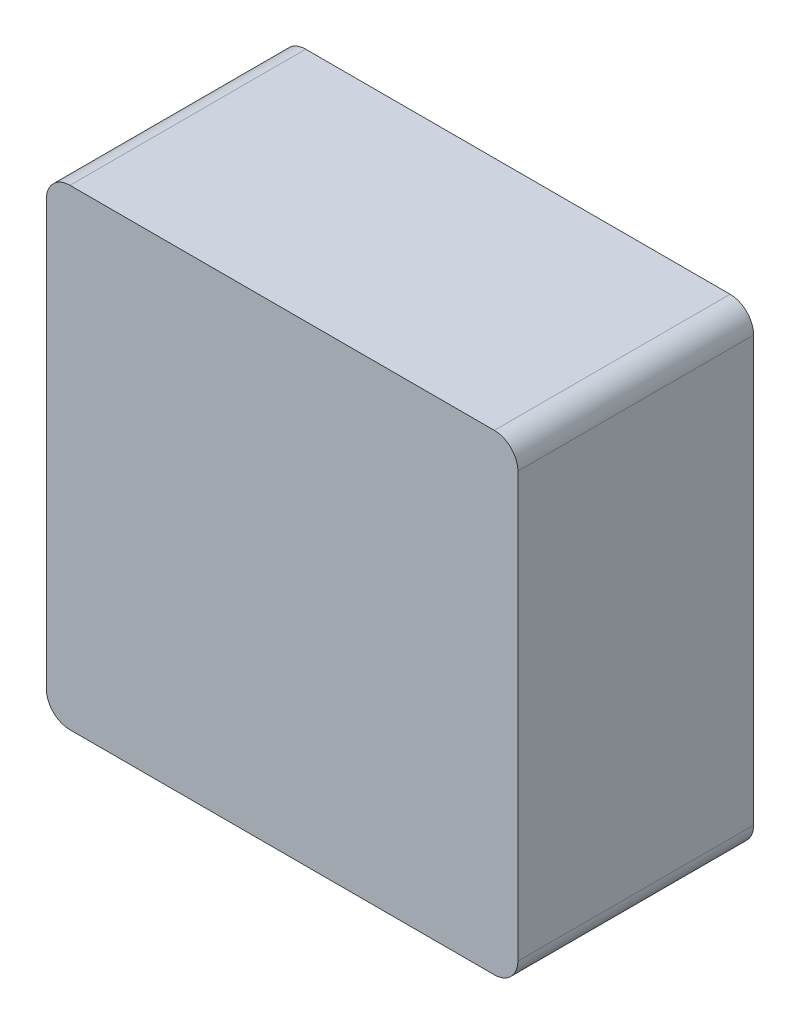
ISO-10303-21;
HEADER;
FILE_DESCRIPTION(('STEP AP214'),'2;1');
FILE_NAME('part.step','',(''),(''),'','','');
FILE_SCHEMA(('AUTOMOTIVE_DESIGN { 1 0 10303 214 1 1 1 1 }'));
ENDSEC;
DATA;
#1=APPLICATION_CONTEXT('core data for automotive mechanical design processes');
#2=APPLICATION_PROTOCOL_DEFINITION('international standard','automotive_design',2000,#1);
#3=PRODUCT_CONTEXT('',#1,'mechanical');
#4=PRODUCT('Part','Part','',(#3));
#5=PRODUCT_RELATED_PRODUCT_CATEGORY('part','',(#4));
#6=PRODUCT_DEFINITION_FORMATION('','',#4);
#7=PRODUCT_DEFINITION_CONTEXT('part definition',#1,'design');
#8=PRODUCT_DEFINITION('design','',#6,#7);
#9=PRODUCT_DEFINITION_SHAPE('','',#8);
#10=(LENGTH_UNIT() NAMED_UNIT(*) SI_UNIT(.MILLI.,.METRE.));
#11=(NAMED_UNIT(*) PLANE_ANGLE_UNIT() SI_UNIT($,.RADIAN.));
#12=(NAMED_UNIT(*) SI_UNIT($,.STERADIAN.) SOLID_ANGLE_UNIT());
#13=UNCERTAINTY_MEASURE_WITH_UNIT(LENGTH_MEASURE(1.E-05),#10,'distance_accuracy_value','');
#14=(GEOMETRIC_REPRESENTATION_CONTEXT(3) GLOBAL_UNCERTAINTY_ASSIGNED_CONTEXT((#13)) GLOBAL_UNIT_ASSIGNED_CONTEXT((#10,
#11,#12)) REPRESENTATION_CONTEXT('',''));
#15=CARTESIAN_POINT('',(0.,0.,0.));
#16=DIRECTION('',(0.,0.,1.));
#17=DIRECTION('',(1.,0.,0.));
#18=AXIS2_PLACEMENT_3D('',#15,#16,#17);
#19=CARTESIAN_POINT('',(0.,0.,50.));
#20=DIRECTION('',(0.,0.,-1.));
#21=DIRECTION('',(-1.,0.,0.));
#22=AXIS2_PLACEMENT_3D('',#19,#20,#21);
#23=CYLINDRICAL_SURFACE('',#22,50.);
#24=CARTESIAN_POINT('',(0.,0.,10.));
#25=DIRECTION('',(0.,0.,1.));
#26=DIRECTION('',(1.,0.,0.));
#27=AXIS2_PLACEMENT_3D('',#24,#25,#26);
#28=CIRCLE('',#27,50.);
#29=CARTESIAN_POINT('',(50.,0.,10.));
#30=VERTEX_POINT('',#29);
#31=EDGE_CURVE('E160',#30,#30,#28,.T.);
#32=ORIENTED_EDGE('',*,*,#31,.T.);
#33=EDGE_LOOP('',(#32));
#34=FACE_BOUND('',#33,.T.);
#35=CARTESIAN_POINT('',(0.,0.,40.));
#36=DIRECTION('',(0.,0.,1.));
#37=DIRECTION('',(1.,0.,0.));
#38=AXIS2_PLACEMENT_3D('',#35,#36,#37);
#39=CIRCLE('',#38,50.);
#40=CARTESIAN_POINT('',(50.,0.,40.));
#41=VERTEX_POINT('',#40);
#42=EDGE_CURVE('E156',#41,#41,#39,.F.);
#43=ORIENTED_EDGE('',*,*,#42,.T.);
#44=EDGE_LOOP('',(#43));
#45=FACE_BOUND('',#44,.T.);
#46=ADVANCED_FACE('F51',(#34,#45),#23,.T.);
#47=CARTESIAN_POINT('',(0.,0.,0.));
#48=DIRECTION('',(0.,0.,1.));
#49=DIRECTION('',(1.,0.,0.));
#50=AXIS2_PLACEMENT_3D('',#47,#48,#49);
#51=PLANE('',#50);
#52=CARTESIAN_POINT('',(0.,0.,0.));
#53=DIRECTION('',(0.,0.,1.));
#54=DIRECTION('',(1.,0.,0.));
#55=AXIS2_PLACEMENT_3D('',#52,#53,#54);
#56=CIRCLE('',#55,40.);
#57=CARTESIAN_POINT('',(40.,0.,0.));
#58=VERTEX_POINT('',#57);
#59=EDGE_CURVE('E128',#58,#58,#56,.F.);
#60=ORIENTED_EDGE('',*,*,#59,.T.);
#61=EDGE_LOOP('',(#60));
#62=FACE_BOUND('',#61,.T.);
#63=ADVANCED_FACE('F249',(#62),#51,.F.);
#64=CARTESIAN_POINT('',(-100.,100.,150.));
#65=DIRECTION('',(1.,0.,0.));
#66=DIRECTION('',(0.,1.,0.));
#67=AXIS2_PLACEMENT_3D('',#64,#65,#66);
#68=PLANE('',#67);
#69=DIRECTION('',(0.,-1.,0.));
#70=VECTOR('',#69,1.);
#71=CARTESIAN_POINT('',(-100.,100.,50.));
#72=LINE('',#71,#70);
#73=CARTESIAN_POINT('',(-100.,90.,50.));
#74=VERTEX_POINT('',#73);
#75=CARTESIAN_POINT('',(-100.,-90.,50.));
#76=VERTEX_POINT('',#75);
#77=EDGE_CURVE('E134',#74,#76,#72,.T.);
#78=ORIENTED_EDGE('',*,*,#77,.T.);
#79=DIRECTION('',(0.,0.,-1.));
#80=VECTOR('',#79,1.);
#81=CARTESIAN_POINT('',(-100.,-90.,150.));
#82=LINE('',#81,#80);
#83=CARTESIAN_POINT('',(-100.,-90.,150.));
#84=VERTEX_POINT('',#83);
#85=EDGE_CURVE('E11',#76,#84,#82,.F.);
#86=ORIENTED_EDGE('',*,*,#85,.T.);
#87=DIRECTION('',(0.,-1.,0.));
#88=VECTOR('',#87,1.);
#89=CARTESIAN_POINT('',(-100.,100.,150.));
#90=LINE('',#89,#88);
#91=CARTESIAN_POINT('',(-100.,90.,150.));
#92=VERTEX_POINT('',#91);
#93=EDGE_CURVE('E136',#92,#84,#90,.T.);
#94=ORIENTED_EDGE('',*,*,#93,.F.);
#95=DIRECTION('',(0.,0.,-1.));
#96=VECTOR('',#95,1.);
#97=CARTESIAN_POINT('',(-100.,90.,150.));
#98=LINE('',#97,#96);
#99=EDGE_CURVE('E60',#92,#74,#98,.T.);
#100=ORIENTED_EDGE('',*,*,#99,.T.);
#101=EDGE_LOOP('',(#78,#86,#94,#100));
#102=FACE_BOUND('',#101,.T.);
#103=ADVANCED_FACE('F133',(#102),#68,.F.);
#104=CARTESIAN_POINT('',(-100.,-100.,150.));
#105=DIRECTION('',(0.,1.,0.));
#106=DIRECTION('',(0.,0.,1.));
#107=AXIS2_PLACEMENT_3D('',#104,#105,#106);
#108=PLANE('',#107);
#109=DIRECTION('',(1.,0.,0.));
#110=VECTOR('',#109,1.);
#111=CARTESIAN_POINT('',(-100.,-100.,50.));
#112=LINE('',#111,#110);
#113=CARTESIAN_POINT('',(-90.,-100.,50.));
#114=VERTEX_POINT('',#113);
#115=CARTESIAN_POINT('',(90.,-100.,50.));
#116=VERTEX_POINT('',#115);
#117=EDGE_CURVE('E141',#114,#116,#112,.T.);
#118=ORIENTED_EDGE('',*,*,#117,.T.);
#119=DIRECTION('',(0.,0.,-1.));
#120=VECTOR('',#119,1.);
#121=CARTESIAN_POINT('',(90.,-100.,150.));
#122=LINE('',#121,#120);
#123=CARTESIAN_POINT('',(90.,-100.,150.));
#124=VERTEX_POINT('',#123);
#125=EDGE_CURVE('E67',#116,#124,#122,.F.);
#126=ORIENTED_EDGE('',*,*,#125,.T.);
#127=DIRECTION('',(1.,0.,0.));
#128=VECTOR('',#127,1.);
#129=CARTESIAN_POINT('',(-100.,-100.,150.));
#130=LINE('',#129,#128);
#131=CARTESIAN_POINT('',(-90.,-100.,150.));
#132=VERTEX_POINT('',#131);
#133=EDGE_CURVE('E214',#132,#124,#130,.T.);
#134=ORIENTED_EDGE('',*,*,#133,.F.);
#135=DIRECTION('',(0.,0.,-1.));
#136=VECTOR('',#135,1.);
#137=CARTESIAN_POINT('',(-90.,-100.,150.));
#138=LINE('',#137,#136);
#139=EDGE_CURVE('E203',#132,#114,#138,.T.);
#140=ORIENTED_EDGE('',*,*,#139,.T.);
#141=EDGE_LOOP('',(#118,#126,#134,#140));
#142=FACE_BOUND('',#141,.T.);
#143=ADVANCED_FACE('F222',(#142),#108,.F.);
#144=CARTESIAN_POINT('',(100.,100.,150.));
#145=DIRECTION('',(-1.,0.,0.));
#146=DIRECTION('',(0.,-1.,0.));
#147=AXIS2_PLACEMENT_3D('',#144,#145,#146);
#148=PLANE('',#147);
#149=DIRECTION('',(0.,1.,0.));
#150=VECTOR('',#149,1.);
#151=CARTESIAN_POINT('',(100.,100.,50.));
#152=LINE('',#151,#150);
#153=CARTESIAN_POINT('',(100.,-90.,50.));
#154=VERTEX_POINT('',#153);
#155=CARTESIAN_POINT('',(100.,90.,50.));
#156=VERTEX_POINT('',#155);
#157=EDGE_CURVE('E144',#154,#156,#152,.T.);
#158=ORIENTED_EDGE('',*,*,#157,.T.);
#159=DIRECTION('',(0.,0.,-1.));
#160=VECTOR('',#159,1.);
#161=CARTESIAN_POINT('',(100.,90.,150.));
#162=LINE('',#161,#160);
#163=CARTESIAN_POINT('',(100.,90.,150.));
#164=VERTEX_POINT('',#163);
#165=EDGE_CURVE('E189',#156,#164,#162,.F.);
#166=ORIENTED_EDGE('',*,*,#165,.T.);
#167=DIRECTION('',(0.,1.,0.));
#168=VECTOR('',#167,1.);
#169=CARTESIAN_POINT('',(100.,100.,150.));
#170=LINE('',#169,#168);
#171=CARTESIAN_POINT('',(100.,-90.,150.));
#172=VERTEX_POINT('',#171);
#173=EDGE_CURVE('E211',#172,#164,#170,.T.);
#174=ORIENTED_EDGE('',*,*,#173,.F.);
#175=DIRECTION('',(0.,0.,-1.));
#176=VECTOR('',#175,1.);
#177=CARTESIAN_POINT('',(100.,-90.,150.));
#178=LINE('',#177,#176);
#179=EDGE_CURVE('E185',#172,#154,#178,.T.);
#180=ORIENTED_EDGE('',*,*,#179,.T.);
#181=EDGE_LOOP('',(#158,#166,#174,#180));
#182=FACE_BOUND('',#181,.T.);
#183=ADVANCED_FACE('F230',(#182),#148,.F.);
#184=CARTESIAN_POINT('',(-100.,100.,150.));
#185=DIRECTION('',(0.,-1.,0.));
#186=DIRECTION('',(0.,0.,-1.));
#187=AXIS2_PLACEMENT_3D('',#184,#185,#186);
#188=PLANE('',#187);
#189=DIRECTION('',(-1.,0.,0.));
#190=VECTOR('',#189,1.);
#191=CARTESIAN_POINT('',(-100.,100.,150.));
#192=LINE('',#191,#190);
#193=CARTESIAN_POINT('',(90.,100.,150.));
#194=VERTEX_POINT('',#193);
#195=CARTESIAN_POINT('',(-90.,100.,150.));
#196=VERTEX_POINT('',#195);
#197=EDGE_CURVE('E147',#194,#196,#192,.T.);
#198=ORIENTED_EDGE('',*,*,#197,.F.);
#199=DIRECTION('',(0.,0.,-1.));
#200=VECTOR('',#199,1.);
#201=CARTESIAN_POINT('',(90.,100.,150.));
#202=LINE('',#201,#200);
#203=CARTESIAN_POINT('',(90.,100.,50.));
#204=VERTEX_POINT('',#203);
#205=EDGE_CURVE('E181',#194,#204,#202,.T.);
#206=ORIENTED_EDGE('',*,*,#205,.T.);
#207=DIRECTION('',(-1.,0.,0.));
#208=VECTOR('',#207,1.);
#209=CARTESIAN_POINT('',(-100.,100.,50.));
#210=LINE('',#209,#208);
#211=CARTESIAN_POINT('',(-90.,100.,50.));
#212=VERTEX_POINT('',#211);
#213=EDGE_CURVE('E153',#204,#212,#210,.T.);
#214=ORIENTED_EDGE('',*,*,#213,.T.);
#215=DIRECTION('',(0.,0.,-1.));
#216=VECTOR('',#215,1.);
#217=CARTESIAN_POINT('',(-90.,100.,150.));
#218=LINE('',#217,#216);
#219=EDGE_CURVE('E121',#212,#196,#218,.F.);
#220=ORIENTED_EDGE('',*,*,#219,.T.);
#221=EDGE_LOOP('',(#198,#206,#214,#220));
#222=FACE_BOUND('',#221,.T.);
#223=ADVANCED_FACE('F238',(#222),#188,.F.);
#224=CARTESIAN_POINT('',(0.,0.,150.));
#225=DIRECTION('',(0.,0.,1.));
#226=DIRECTION('',(1.,0.,0.));
#227=AXIS2_PLACEMENT_3D('',#224,#225,#226);
#228=PLANE('',#227);
#229=ORIENTED_EDGE('',*,*,#173,.T.);
#230=CARTESIAN_POINT('',(90.,90.,150.));
#231=DIRECTION('',(0.,0.,1.));
#232=DIRECTION('',(1.,0.,0.));
#233=AXIS2_PLACEMENT_3D('',#230,#231,#232);
#234=CIRCLE('',#233,10.);
#235=EDGE_CURVE('E200',#164,#194,#234,.T.);
#236=ORIENTED_EDGE('',*,*,#235,.T.);
#237=ORIENTED_EDGE('',*,*,#197,.T.);
#238=CARTESIAN_POINT('',(-90.,90.,150.));
#239=DIRECTION('',(0.,0.,1.));
#240=DIRECTION('',(1.,0.,0.));
#241=AXIS2_PLACEMENT_3D('',#238,#239,#240);
#242=CIRCLE('',#241,10.);
#243=EDGE_CURVE('E192',#196,#92,#242,.T.);
#244=ORIENTED_EDGE('',*,*,#243,.T.);
#245=ORIENTED_EDGE('',*,*,#93,.T.);
#246=CARTESIAN_POINT('',(-90.,-90.,150.));
#247=DIRECTION('',(0.,0.,1.));
#248=DIRECTION('',(1.,0.,0.));
#249=AXIS2_PLACEMENT_3D('',#246,#247,#248);
#250=CIRCLE('',#249,10.);
#251=EDGE_CURVE('E74',#84,#132,#250,.T.);
#252=ORIENTED_EDGE('',*,*,#251,.T.);
#253=ORIENTED_EDGE('',*,*,#133,.T.);
#254=CARTESIAN_POINT('',(90.,-90.,150.));
#255=DIRECTION('',(0.,0.,1.));
#256=DIRECTION('',(1.,0.,0.));
#257=AXIS2_PLACEMENT_3D('',#254,#255,#256);
#258=CIRCLE('',#257,10.);
#259=EDGE_CURVE('E197',#124,#172,#258,.T.);
#260=ORIENTED_EDGE('',*,*,#259,.T.);
#261=EDGE_LOOP('',(#229,#236,#237,#244,#245,#252,#253,#260));
#262=FACE_BOUND('',#261,.T.);
#263=ADVANCED_FACE('F218',(#262),#228,.T.);
#264=CARTESIAN_POINT('',(0.,0.,50.));
#265=DIRECTION('',(0.,0.,1.));
#266=DIRECTION('',(1.,0.,0.));
#267=AXIS2_PLACEMENT_3D('',#264,#265,#266);
#268=PLANE('',#267);
#269=CARTESIAN_POINT('',(0.,0.,50.));
#270=DIRECTION('',(0.,0.,1.));
#271=DIRECTION('',(1.,0.,0.));
#272=AXIS2_PLACEMENT_3D('',#269,#270,#271);
#273=CIRCLE('',#272,60.);
#274=CARTESIAN_POINT('',(60.,0.,50.));
#275=VERTEX_POINT('',#274);
#276=EDGE_CURVE('E175',#275,#275,#273,.T.);
#277=ORIENTED_EDGE('',*,*,#276,.T.);
#278=EDGE_LOOP('',(#277));
#279=FACE_BOUND('',#278,.T.);
#280=ORIENTED_EDGE('',*,*,#213,.F.);
#281=CARTESIAN_POINT('',(90.,90.,50.));
#282=DIRECTION('',(0.,0.,1.));
#283=DIRECTION('',(1.,0.,0.));
#284=AXIS2_PLACEMENT_3D('',#281,#282,#283);
#285=CIRCLE('',#284,10.);
#286=EDGE_CURVE('E172',#204,#156,#285,.F.);
#287=ORIENTED_EDGE('',*,*,#286,.T.);
#288=ORIENTED_EDGE('',*,*,#157,.F.);
#289=CARTESIAN_POINT('',(90.,-90.,50.));
#290=DIRECTION('',(0.,0.,1.));
#291=DIRECTION('',(1.,0.,0.));
#292=AXIS2_PLACEMENT_3D('',#289,#290,#291);
#293=CIRCLE('',#292,10.);
#294=EDGE_CURVE('E169',#154,#116,#293,.F.);
#295=ORIENTED_EDGE('',*,*,#294,.T.);
#296=ORIENTED_EDGE('',*,*,#117,.F.);
#297=CARTESIAN_POINT('',(-90.,-90.,50.));
#298=DIRECTION('',(0.,0.,1.));
#299=DIRECTION('',(1.,0.,0.));
#300=AXIS2_PLACEMENT_3D('',#297,#298,#299);
#301=CIRCLE('',#300,10.);
#302=EDGE_CURVE('E127',#114,#76,#301,.F.);
#303=ORIENTED_EDGE('',*,*,#302,.T.);
#304=ORIENTED_EDGE('',*,*,#77,.F.);
#305=CARTESIAN_POINT('',(-90.,90.,50.));
#306=DIRECTION('',(0.,0.,1.));
#307=DIRECTION('',(1.,0.,0.));
#308=AXIS2_PLACEMENT_3D('',#305,#306,#307);
#309=CIRCLE('',#308,10.);
#310=EDGE_CURVE('E118',#74,#212,#309,.F.);
#311=ORIENTED_EDGE('',*,*,#310,.T.);
#312=EDGE_LOOP('',(#280,#287,#288,#295,#296,#303,#304,#311));
#313=FACE_BOUND('',#312,.T.);
#314=ADVANCED_FACE('F138',(#279,#313),#268,.F.);
#315=CARTESIAN_POINT('',(0.,0.,10.));
#316=DIRECTION('',(0.,0.,1.));
#317=DIRECTION('',(1.,0.,0.));
#318=AXIS2_PLACEMENT_3D('',#315,#316,#317);
#319=TOROIDAL_SURFACE('',#318,40.,10.);
#320=ORIENTED_EDGE('',*,*,#59,.F.);
#321=EDGE_LOOP('',(#320));
#322=FACE_BOUND('',#321,.T.);
#323=ORIENTED_EDGE('',*,*,#31,.F.);
#324=EDGE_LOOP('',(#323));
#325=FACE_BOUND('',#324,.T.);
#326=ADVANCED_FACE('F260',(#322,#325),#319,.T.);
#327=CARTESIAN_POINT('',(0.,0.,40.));
#328=DIRECTION('',(0.,0.,1.));
#329=DIRECTION('',(1.,0.,0.));
#330=AXIS2_PLACEMENT_3D('',#327,#328,#329);
#331=TOROIDAL_SURFACE('',#330,60.,10.);
#332=ORIENTED_EDGE('',*,*,#42,.F.);
#333=EDGE_LOOP('',(#332));
#334=FACE_BOUND('',#333,.T.);
#335=ORIENTED_EDGE('',*,*,#276,.F.);
#336=EDGE_LOOP('',(#335));
#337=FACE_BOUND('',#336,.T.);
#338=ADVANCED_FACE('F263',(#334,#337),#331,.F.);
#339=CARTESIAN_POINT('',(90.,90.,150.));
#340=DIRECTION('',(0.,0.,-1.));
#341=DIRECTION('',(-1.,0.,0.));
#342=AXIS2_PLACEMENT_3D('',#339,#340,#341);
#343=CYLINDRICAL_SURFACE('',#342,10.);
#344=ORIENTED_EDGE('',*,*,#235,.F.);
#345=ORIENTED_EDGE('',*,*,#165,.F.);
#346=ORIENTED_EDGE('',*,*,#286,.F.);
#347=ORIENTED_EDGE('',*,*,#205,.F.);
#348=EDGE_LOOP('',(#344,#345,#346,#347));
#349=FACE_BOUND('',#348,.T.);
#350=ADVANCED_FACE('F236',(#349),#343,.T.);
#351=CARTESIAN_POINT('',(90.,-90.,150.));
#352=DIRECTION('',(0.,0.,-1.));
#353=DIRECTION('',(-1.,0.,0.));
#354=AXIS2_PLACEMENT_3D('',#351,#352,#353);
#355=CYLINDRICAL_SURFACE('',#354,10.);
#356=ORIENTED_EDGE('',*,*,#259,.F.);
#357=ORIENTED_EDGE('',*,*,#125,.F.);
#358=ORIENTED_EDGE('',*,*,#294,.F.);
#359=ORIENTED_EDGE('',*,*,#179,.F.);
#360=EDGE_LOOP('',(#356,#357,#358,#359));
#361=FACE_BOUND('',#360,.T.);
#362=ADVANCED_FACE('F227',(#361),#355,.T.);
#363=CARTESIAN_POINT('',(-90.,-90.,150.));
#364=DIRECTION('',(0.,0.,-1.));
#365=DIRECTION('',(-1.,0.,0.));
#366=AXIS2_PLACEMENT_3D('',#363,#364,#365);
#367=CYLINDRICAL_SURFACE('',#366,10.);
#368=ORIENTED_EDGE('',*,*,#251,.F.);
#369=ORIENTED_EDGE('',*,*,#85,.F.);
#370=ORIENTED_EDGE('',*,*,#302,.F.);
#371=ORIENTED_EDGE('',*,*,#139,.F.);
#372=EDGE_LOOP('',(#368,#369,#370,#371));
#373=FACE_BOUND('',#372,.T.);
#374=ADVANCED_FACE('F221',(#373),#367,.T.);
#375=CARTESIAN_POINT('',(-90.,90.,150.));
#376=DIRECTION('',(0.,0.,-1.));
#377=DIRECTION('',(-1.,0.,0.));
#378=AXIS2_PLACEMENT_3D('',#375,#376,#377);
#379=CYLINDRICAL_SURFACE('',#378,10.);
#380=ORIENTED_EDGE('',*,*,#243,.F.);
#381=ORIENTED_EDGE('',*,*,#219,.F.);
#382=ORIENTED_EDGE('',*,*,#310,.F.);
#383=ORIENTED_EDGE('',*,*,#99,.F.);
#384=EDGE_LOOP('',(#380,#381,#382,#383));
#385=FACE_BOUND('',#384,.T.);
#386=ADVANCED_FACE('F53',(#385),#379,.T.);
#387=CLOSED_SHELL('',(#46,#63,#103,#143,#183,#223,#263,#314,#326,#338,#350,#362,#374,#386));
#388=MANIFOLD_SOLID_BREP('B2',#387);
#389=ADVANCED_BREP_SHAPE_REPRESENTATION('',(#18,#388),#14);
#390=SHAPE_DEFINITION_REPRESENTATION(#9,#389);
ENDSEC;
END-ISO-10303-21;
